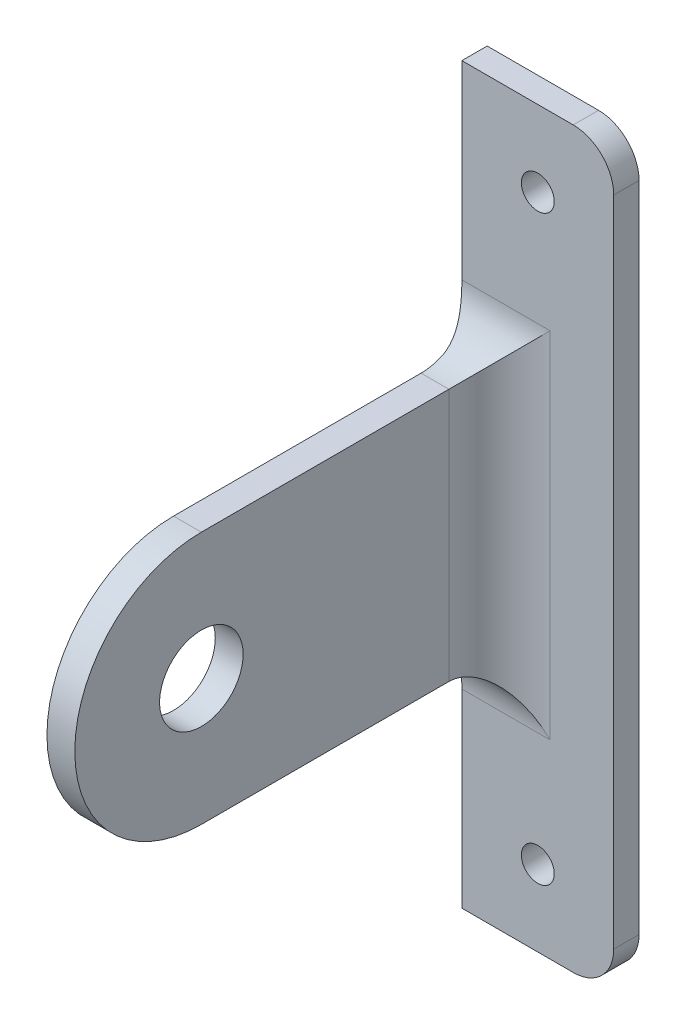
ISO-10303-21;
HEADER;
FILE_DESCRIPTION(('STEP AP214'),'2;1');
FILE_NAME('part.step','',(''),(''),'','','');
FILE_SCHEMA(('AUTOMOTIVE_DESIGN { 1 0 10303 214 1 1 1 1 }'));
ENDSEC;
DATA;
#1=APPLICATION_CONTEXT('core data for automotive mechanical design processes');
#2=APPLICATION_PROTOCOL_DEFINITION('international standard','automotive_design',2000,#1);
#3=PRODUCT_CONTEXT('',#1,'mechanical');
#4=PRODUCT('Part','Part','',(#3));
#5=PRODUCT_RELATED_PRODUCT_CATEGORY('part','',(#4));
#6=PRODUCT_DEFINITION_FORMATION('','',#4);
#7=PRODUCT_DEFINITION_CONTEXT('part definition',#1,'design');
#8=PRODUCT_DEFINITION('design','',#6,#7);
#9=PRODUCT_DEFINITION_SHAPE('','',#8);
#10=(LENGTH_UNIT() NAMED_UNIT(*) SI_UNIT(.MILLI.,.METRE.));
#11=(NAMED_UNIT(*) PLANE_ANGLE_UNIT() SI_UNIT($,.RADIAN.));
#12=(NAMED_UNIT(*) SI_UNIT($,.STERADIAN.) SOLID_ANGLE_UNIT());
#13=UNCERTAINTY_MEASURE_WITH_UNIT(LENGTH_MEASURE(1.E-05),#10,'distance_accuracy_value','');
#14=(GEOMETRIC_REPRESENTATION_CONTEXT(3) GLOBAL_UNCERTAINTY_ASSIGNED_CONTEXT((#13)) GLOBAL_UNIT_ASSIGNED_CONTEXT((#10,
#11,#12)) REPRESENTATION_CONTEXT('',''));
#15=CARTESIAN_POINT('',(0.,0.,0.));
#16=DIRECTION('',(0.,0.,1.));
#17=DIRECTION('',(1.,0.,0.));
#18=AXIS2_PLACEMENT_3D('',#15,#16,#17);
#19=CARTESIAN_POINT('',(0.,-12.5,0.));
#20=DIRECTION('',(0.,1.,0.));
#21=DIRECTION('',(0.,0.,1.));
#22=AXIS2_PLACEMENT_3D('',#19,#20,#21);
#23=PLANE('',#22);
#24=DIRECTION('',(0.,0.,1.));
#25=VECTOR('',#24,1.);
#26=CARTESIAN_POINT('',(0.,-12.5,-4.125));
#27=LINE('',#26,#25);
#28=CARTESIAN_POINT('',(0.,-12.5,-24.45));
#29=VERTEX_POINT('',#28);
#30=CARTESIAN_POINT('',(0.,-12.5,0.));
#31=VERTEX_POINT('',#30);
#32=EDGE_CURVE('E247',#29,#31,#27,.T.);
#33=ORIENTED_EDGE('',*,*,#32,.F.);
#34=DIRECTION('',(-1.,0.,0.));
#35=VECTOR('',#34,1.);
#36=CARTESIAN_POINT('',(2.75,-12.5,-24.45));
#37=LINE('',#36,#35);
#38=CARTESIAN_POINT('',(2.75,-12.5,-24.45));
#39=VERTEX_POINT('',#38);
#40=EDGE_CURVE('E265',#29,#39,#37,.F.);
#41=ORIENTED_EDGE('',*,*,#40,.T.);
#42=DIRECTION('',(0.,0.,-1.));
#43=VECTOR('',#42,1.);
#44=CARTESIAN_POINT('',(2.75,-12.5,-4.125));
#45=LINE('',#44,#43);
#46=CARTESIAN_POINT('',(2.75,-12.5,0.));
#47=VERTEX_POINT('',#46);
#48=EDGE_CURVE('E231',#47,#39,#45,.T.);
#49=ORIENTED_EDGE('',*,*,#48,.F.);
#50=DIRECTION('',(-1.,0.,0.));
#51=VECTOR('',#50,1.);
#52=CARTESIAN_POINT('',(2.75,-12.5,0.));
#53=LINE('',#52,#51);
#54=EDGE_CURVE('E218',#47,#31,#53,.T.);
#55=ORIENTED_EDGE('',*,*,#54,.T.);
#56=EDGE_LOOP('',(#33,#41,#49,#55));
#57=FACE_BOUND('',#56,.T.);
#58=ADVANCED_FACE('F43',(#57),#23,.F.);
#59=CARTESIAN_POINT('',(0.,12.5,0.));
#60=DIRECTION('',(0.,1.,0.));
#61=DIRECTION('',(0.,0.,1.));
#62=AXIS2_PLACEMENT_3D('',#59,#60,#61);
#63=PLANE('',#62);
#64=DIRECTION('',(0.,0.,-1.));
#65=VECTOR('',#64,1.);
#66=CARTESIAN_POINT('',(2.75,12.5,-4.125));
#67=LINE('',#66,#65);
#68=CARTESIAN_POINT('',(2.75,12.5,0.));
#69=VERTEX_POINT('',#68);
#70=CARTESIAN_POINT('',(2.75,12.5,-24.45));
#71=VERTEX_POINT('',#70);
#72=EDGE_CURVE('E242',#69,#71,#67,.T.);
#73=ORIENTED_EDGE('',*,*,#72,.T.);
#74=DIRECTION('',(-1.,0.,0.));
#75=VECTOR('',#74,1.);
#76=CARTESIAN_POINT('',(0.,12.5,-24.45));
#77=LINE('',#76,#75);
#78=CARTESIAN_POINT('',(0.,12.5,-24.45));
#79=VERTEX_POINT('',#78);
#80=EDGE_CURVE('E272',#71,#79,#77,.T.);
#81=ORIENTED_EDGE('',*,*,#80,.T.);
#82=DIRECTION('',(0.,0.,1.));
#83=VECTOR('',#82,1.);
#84=CARTESIAN_POINT('',(0.,12.5,-4.125));
#85=LINE('',#84,#83);
#86=CARTESIAN_POINT('',(0.,12.5,0.));
#87=VERTEX_POINT('',#86);
#88=EDGE_CURVE('E246',#79,#87,#85,.T.);
#89=ORIENTED_EDGE('',*,*,#88,.T.);
#90=DIRECTION('',(-1.,0.,0.));
#91=VECTOR('',#90,1.);
#92=CARTESIAN_POINT('',(2.75,12.5,0.));
#93=LINE('',#92,#91);
#94=EDGE_CURVE('E223',#69,#87,#93,.T.);
#95=ORIENTED_EDGE('',*,*,#94,.F.);
#96=EDGE_LOOP('',(#73,#81,#89,#95));
#97=FACE_BOUND('',#96,.T.);
#98=ADVANCED_FACE('F308',(#97),#63,.T.);
#99=CARTESIAN_POINT('',(2.75,12.5,-4.125));
#100=DIRECTION('',(-1.,0.,0.));
#101=DIRECTION('',(0.,0.,1.));
#102=AXIS2_PLACEMENT_3D('',#99,#100,#101);
#103=PLANE('',#102);
#104=CARTESIAN_POINT('',(2.75,0.,0.));
#105=DIRECTION('',(1.,0.,0.));
#106=DIRECTION('',(0.,0.,-1.));
#107=AXIS2_PLACEMENT_3D('',#104,#105,#106);
#108=CIRCLE('',#107,4.125);
#109=CARTESIAN_POINT('',(2.75,0.,-4.125));
#110=VERTEX_POINT('',#109);
#111=EDGE_CURVE('E222',#110,#110,#108,.T.);
#112=ORIENTED_EDGE('',*,*,#111,.F.);
#113=EDGE_LOOP('',(#112));
#114=FACE_BOUND('',#113,.T.);
#115=ORIENTED_EDGE('',*,*,#48,.T.);
#116=DIRECTION('',(0.,-1.,0.));
#117=VECTOR('',#116,1.);
#118=CARTESIAN_POINT('',(2.75,12.5,-24.45));
#119=LINE('',#118,#117);
#120=EDGE_CURVE('E275',#39,#71,#119,.F.);
#121=ORIENTED_EDGE('',*,*,#120,.T.);
#122=ORIENTED_EDGE('',*,*,#72,.F.);
#123=CARTESIAN_POINT('',(2.75,0.,0.));
#124=DIRECTION('',(1.,0.,0.));
#125=DIRECTION('',(0.,0.,-1.));
#126=AXIS2_PLACEMENT_3D('',#123,#124,#125);
#127=CIRCLE('',#126,12.5);
#128=EDGE_CURVE('E232',#69,#47,#127,.T.);
#129=ORIENTED_EDGE('',*,*,#128,.T.);
#130=EDGE_LOOP('',(#115,#121,#122,#129));
#131=FACE_BOUND('',#130,.T.);
#132=ADVANCED_FACE('F298',(#114,#131),#103,.F.);
#133=CARTESIAN_POINT('',(0.,12.5,-4.125));
#134=DIRECTION('',(1.,0.,0.));
#135=DIRECTION('',(0.,0.,-1.));
#136=AXIS2_PLACEMENT_3D('',#133,#134,#135);
#137=PLANE('',#136);
#138=CARTESIAN_POINT('',(0.,0.,0.));
#139=DIRECTION('',(1.,0.,0.));
#140=DIRECTION('',(0.,0.,-1.));
#141=AXIS2_PLACEMENT_3D('',#138,#139,#140);
#142=CIRCLE('',#141,4.125);
#143=CARTESIAN_POINT('',(0.,0.,-4.125));
#144=VERTEX_POINT('',#143);
#145=EDGE_CURVE('E227',#144,#144,#142,.T.);
#146=ORIENTED_EDGE('',*,*,#145,.T.);
#147=EDGE_LOOP('',(#146));
#148=FACE_BOUND('',#147,.T.);
#149=ORIENTED_EDGE('',*,*,#88,.F.);
#150=CARTESIAN_POINT('',(0.,17.5,-24.45));
#151=DIRECTION('',(1.,0.,0.));
#152=DIRECTION('',(0.,0.,-1.));
#153=AXIS2_PLACEMENT_3D('',#150,#151,#152);
#154=CIRCLE('',#153,5.);
#155=CARTESIAN_POINT('',(0.,12.9352791185284,-26.4904223274257));
#156=VERTEX_POINT('',#155);
#157=EDGE_CURVE('E11',#79,#156,#154,.T.);
#158=ORIENTED_EDGE('',*,*,#157,.T.);
#159=CARTESIAN_POINT('',(0.,12.9352791185284,-26.4904223274257));
#160=CARTESIAN_POINT('',(0.,12.5,-26.4904223274257));
#161=B_SPLINE_CURVE_WITH_KNOTS('',1,(#159,#160),.UNSPECIFIED.,.F.,.F.,(2,2),(0.,1.),.UNSPECIFIED.);
#162=CARTESIAN_POINT('',(0.,12.5,-26.4904223274257));
#163=VERTEX_POINT('',#162);
#164=EDGE_CURVE('E281',#156,#163,#161,.T.);
#165=ORIENTED_EDGE('',*,*,#164,.T.);
#166=DIRECTION('',(0.,-1.,0.));
#167=VECTOR('',#166,1.);
#168=CARTESIAN_POINT('',(0.,12.5,-26.4904223274257));
#169=LINE('',#168,#167);
#170=CARTESIAN_POINT('',(0.,-12.5,-26.4904223274257));
#171=VERTEX_POINT('',#170);
#172=EDGE_CURVE('E269',#163,#171,#169,.T.);
#173=ORIENTED_EDGE('',*,*,#172,.T.);
#174=CARTESIAN_POINT('',(0.,-12.5,-26.4904223274257));
#175=CARTESIAN_POINT('',(0.,-12.9352791185284,-26.4904223274257));
#176=B_SPLINE_CURVE_WITH_KNOTS('',1,(#174,#175),.UNSPECIFIED.,.F.,.F.,(2,2),(0.,1.),.UNSPECIFIED.);
#177=CARTESIAN_POINT('',(0.,-12.9352791185284,-26.4904223274257));
#178=VERTEX_POINT('',#177);
#179=EDGE_CURVE('E53',#171,#178,#176,.T.);
#180=ORIENTED_EDGE('',*,*,#179,.T.);
#181=CARTESIAN_POINT('',(0.,-17.5,-24.45));
#182=DIRECTION('',(1.,0.,0.));
#183=DIRECTION('',(0.,0.,-1.));
#184=AXIS2_PLACEMENT_3D('',#181,#182,#183);
#185=CIRCLE('',#184,5.);
#186=EDGE_CURVE('E278',#178,#29,#185,.T.);
#187=ORIENTED_EDGE('',*,*,#186,.T.);
#188=ORIENTED_EDGE('',*,*,#32,.T.);
#189=CARTESIAN_POINT('',(0.,0.,0.));
#190=DIRECTION('',(1.,0.,0.));
#191=DIRECTION('',(0.,0.,-1.));
#192=AXIS2_PLACEMENT_3D('',#189,#190,#191);
#193=CIRCLE('',#192,12.5);
#194=EDGE_CURVE('E217',#87,#31,#193,.T.);
#195=ORIENTED_EDGE('',*,*,#194,.F.);
#196=EDGE_LOOP('',(#149,#158,#165,#173,#180,#187,#188,#195));
#197=FACE_BOUND('',#196,.T.);
#198=ADVANCED_FACE('F287',(#148,#197),#137,.F.);
#199=CARTESIAN_POINT('',(2.75,12.5,-31.95));
#200=DIRECTION('',(0.,0.,1.));
#201=DIRECTION('',(1.,0.,0.));
#202=AXIS2_PLACEMENT_3D('',#199,#200,#201);
#203=PLANE('',#202);
#204=CARTESIAN_POINT('',(6.53,-28.75,-31.95));
#205=DIRECTION('',(0.,0.,1.));
#206=DIRECTION('',(-1.,0.,0.));
#207=AXIS2_PLACEMENT_3D('',#204,#205,#206);
#208=CIRCLE('',#207,1.625);
#209=CARTESIAN_POINT('',(4.905,-28.75,-31.95));
#210=VERTEX_POINT('',#209);
#211=EDGE_CURVE('E395',#210,#210,#208,.T.);
#212=ORIENTED_EDGE('',*,*,#211,.T.);
#213=EDGE_LOOP('',(#212));
#214=FACE_BOUND('',#213,.T.);
#215=CARTESIAN_POINT('',(6.53,28.75,-31.95));
#216=DIRECTION('',(0.,0.,-1.));
#217=DIRECTION('',(-1.,0.,0.));
#218=AXIS2_PLACEMENT_3D('',#215,#216,#217);
#219=CIRCLE('',#218,1.625);
#220=CARTESIAN_POINT('',(4.905,28.75,-31.95));
#221=VERTEX_POINT('',#220);
#222=EDGE_CURVE('E387',#221,#221,#219,.T.);
#223=ORIENTED_EDGE('',*,*,#222,.F.);
#224=EDGE_LOOP('',(#223));
#225=FACE_BOUND('',#224,.T.);
#226=DIRECTION('',(0.,-1.,0.));
#227=VECTOR('',#226,1.);
#228=CARTESIAN_POINT('',(14.03,12.5,-31.95));
#229=LINE('',#228,#227);
#230=CARTESIAN_POINT('',(14.03,32.25,-31.95));
#231=VERTEX_POINT('',#230);
#232=CARTESIAN_POINT('',(14.03,-32.25,-31.95));
#233=VERTEX_POINT('',#232);
#234=EDGE_CURVE('E214',#231,#233,#229,.T.);
#235=ORIENTED_EDGE('',*,*,#234,.T.);
#236=CARTESIAN_POINT('',(10.03,-32.25,-31.95));
#237=DIRECTION('',(0.,0.,1.));
#238=DIRECTION('',(-1.,0.,0.));
#239=AXIS2_PLACEMENT_3D('',#236,#237,#238);
#240=CIRCLE('',#239,4.);
#241=CARTESIAN_POINT('',(10.03,-36.25,-31.95));
#242=VERTEX_POINT('',#241);
#243=EDGE_CURVE('E171',#242,#233,#240,.T.);
#244=ORIENTED_EDGE('',*,*,#243,.F.);
#245=DIRECTION('',(1.,0.,0.));
#246=VECTOR('',#245,1.);
#247=CARTESIAN_POINT('',(-0.97,-36.25,-31.95));
#248=LINE('',#247,#246);
#249=CARTESIAN_POINT('',(-0.97,-36.25,-31.95));
#250=VERTEX_POINT('',#249);
#251=EDGE_CURVE('E166',#250,#242,#248,.T.);
#252=ORIENTED_EDGE('',*,*,#251,.F.);
#253=DIRECTION('',(0.,-1.,0.));
#254=VECTOR('',#253,1.);
#255=CARTESIAN_POINT('',(-0.97,12.5,-31.95));
#256=LINE('',#255,#254);
#257=CARTESIAN_POINT('',(-0.97,36.25,-31.95));
#258=VERTEX_POINT('',#257);
#259=EDGE_CURVE('E210',#258,#250,#256,.T.);
#260=ORIENTED_EDGE('',*,*,#259,.F.);
#261=DIRECTION('',(1.,0.,0.));
#262=VECTOR('',#261,1.);
#263=CARTESIAN_POINT('',(-0.97,36.25,-31.95));
#264=LINE('',#263,#262);
#265=CARTESIAN_POINT('',(10.03,36.25,-31.95));
#266=VERTEX_POINT('',#265);
#267=EDGE_CURVE('E191',#258,#266,#264,.T.);
#268=ORIENTED_EDGE('',*,*,#267,.T.);
#269=CARTESIAN_POINT('',(10.03,32.25,-31.95));
#270=DIRECTION('',(0.,0.,-1.));
#271=DIRECTION('',(-1.,0.,0.));
#272=AXIS2_PLACEMENT_3D('',#269,#270,#271);
#273=CIRCLE('',#272,4.);
#274=EDGE_CURVE('E187',#266,#231,#273,.T.);
#275=ORIENTED_EDGE('',*,*,#274,.T.);
#276=EDGE_LOOP('',(#235,#244,#252,#260,#268,#275));
#277=FACE_BOUND('',#276,.T.);
#278=ADVANCED_FACE('F297',(#214,#225,#277),#203,.F.);
#279=CARTESIAN_POINT('',(2.75,0.,0.));
#280=DIRECTION('',(-1.,0.,0.));
#281=DIRECTION('',(0.,0.,1.));
#282=AXIS2_PLACEMENT_3D('',#279,#280,#281);
#283=CYLINDRICAL_SURFACE('',#282,12.5);
#284=ORIENTED_EDGE('',*,*,#194,.T.);
#285=ORIENTED_EDGE('',*,*,#54,.F.);
#286=ORIENTED_EDGE('',*,*,#128,.F.);
#287=ORIENTED_EDGE('',*,*,#94,.T.);
#288=EDGE_LOOP('',(#284,#285,#286,#287));
#289=FACE_BOUND('',#288,.T.);
#290=ADVANCED_FACE('F304',(#289),#283,.T.);
#291=CARTESIAN_POINT('',(2.75,0.,0.));
#292=DIRECTION('',(-1.,0.,0.));
#293=DIRECTION('',(0.,0.,1.));
#294=AXIS2_PLACEMENT_3D('',#291,#292,#293);
#295=CYLINDRICAL_SURFACE('',#294,4.125);
#296=ORIENTED_EDGE('',*,*,#111,.T.);
#297=EDGE_LOOP('',(#296));
#298=FACE_BOUND('',#297,.T.);
#299=ORIENTED_EDGE('',*,*,#145,.F.);
#300=EDGE_LOOP('',(#299));
#301=FACE_BOUND('',#300,.T.);
#302=ADVANCED_FACE('F440',(#298,#301),#295,.F.);
#303=CARTESIAN_POINT('',(-0.97,12.5,-31.95));
#304=DIRECTION('',(1.,0.,0.));
#305=DIRECTION('',(0.,0.,-1.));
#306=AXIS2_PLACEMENT_3D('',#303,#304,#305);
#307=PLANE('',#306);
#308=ORIENTED_EDGE('',*,*,#259,.T.);
#309=DIRECTION('',(0.,0.,-1.));
#310=VECTOR('',#309,1.);
#311=CARTESIAN_POINT('',(-0.97,-36.25,-29.45));
#312=LINE('',#311,#310);
#313=CARTESIAN_POINT('',(-0.97,-36.25,-29.45));
#314=VERTEX_POINT('',#313);
#315=EDGE_CURVE('E177',#314,#250,#312,.T.);
#316=ORIENTED_EDGE('',*,*,#315,.F.);
#317=DIRECTION('',(0.,-1.,0.));
#318=VECTOR('',#317,1.);
#319=CARTESIAN_POINT('',(-0.97,12.5,-29.45));
#320=LINE('',#319,#318);
#321=CARTESIAN_POINT('',(-0.97,-17.5,-29.45));
#322=VERTEX_POINT('',#321);
#323=EDGE_CURVE('E155',#322,#314,#320,.T.);
#324=ORIENTED_EDGE('',*,*,#323,.F.);
#325=CARTESIAN_POINT('',(-0.97,17.5,-29.45));
#326=VERTEX_POINT('',#325);
#327=EDGE_CURVE('E211',#326,#322,#320,.T.);
#328=ORIENTED_EDGE('',*,*,#327,.F.);
#329=CARTESIAN_POINT('',(-0.97,36.25,-29.45));
#330=VERTEX_POINT('',#329);
#331=EDGE_CURVE('E206',#330,#326,#320,.T.);
#332=ORIENTED_EDGE('',*,*,#331,.F.);
#333=DIRECTION('',(0.,0.,-1.));
#334=VECTOR('',#333,1.);
#335=CARTESIAN_POINT('',(-0.97,36.25,-29.45));
#336=LINE('',#335,#334);
#337=EDGE_CURVE('E190',#330,#258,#336,.T.);
#338=ORIENTED_EDGE('',*,*,#337,.T.);
#339=EDGE_LOOP('',(#308,#316,#324,#328,#332,#338));
#340=FACE_BOUND('',#339,.T.);
#341=ADVANCED_FACE('F406',(#340),#307,.F.);
#342=CARTESIAN_POINT('',(14.03,12.5,-29.45));
#343=DIRECTION('',(0.,0.,-1.));
#344=DIRECTION('',(-1.,0.,0.));
#345=AXIS2_PLACEMENT_3D('',#342,#343,#344);
#346=PLANE('',#345);
#347=CARTESIAN_POINT('',(6.53,-28.75,-29.45));
#348=DIRECTION('',(0.,0.,1.));
#349=DIRECTION('',(-1.,0.,0.));
#350=AXIS2_PLACEMENT_3D('',#347,#348,#349);
#351=CIRCLE('',#350,1.625);
#352=CARTESIAN_POINT('',(4.905,-28.75,-29.45));
#353=VERTEX_POINT('',#352);
#354=EDGE_CURVE('E391',#353,#353,#351,.T.);
#355=ORIENTED_EDGE('',*,*,#354,.F.);
#356=EDGE_LOOP('',(#355));
#357=FACE_BOUND('',#356,.T.);
#358=CARTESIAN_POINT('',(6.53,28.75,-29.45));
#359=DIRECTION('',(0.,0.,-1.));
#360=DIRECTION('',(-1.,0.,0.));
#361=AXIS2_PLACEMENT_3D('',#358,#359,#360);
#362=CIRCLE('',#361,1.625);
#363=CARTESIAN_POINT('',(4.905,28.75,-29.45));
#364=VERTEX_POINT('',#363);
#365=EDGE_CURVE('E385',#364,#364,#362,.T.);
#366=ORIENTED_EDGE('',*,*,#365,.T.);
#367=EDGE_LOOP('',(#366));
#368=FACE_BOUND('',#367,.T.);
#369=DIRECTION('',(0.,-1.,0.));
#370=VECTOR('',#369,1.);
#371=CARTESIAN_POINT('',(7.75,-12.5,-29.45));
#372=LINE('',#371,#370);
#373=CARTESIAN_POINT('',(7.75,17.5,-29.45));
#374=VERTEX_POINT('',#373);
#375=CARTESIAN_POINT('',(7.75,-17.5,-29.45));
#376=VERTEX_POINT('',#375);
#377=EDGE_CURVE('E250',#374,#376,#372,.T.);
#378=ORIENTED_EDGE('',*,*,#377,.T.);
#379=DIRECTION('',(-1.,0.,0.));
#380=VECTOR('',#379,1.);
#381=CARTESIAN_POINT('',(0.,-17.5,-29.45));
#382=LINE('',#381,#380);
#383=EDGE_CURVE('E261',#376,#322,#382,.T.);
#384=ORIENTED_EDGE('',*,*,#383,.T.);
#385=ORIENTED_EDGE('',*,*,#323,.T.);
#386=DIRECTION('',(1.,0.,0.));
#387=VECTOR('',#386,1.);
#388=CARTESIAN_POINT('',(-0.97,-36.25,-29.45));
#389=LINE('',#388,#387);
#390=CARTESIAN_POINT('',(10.03,-36.25,-29.45));
#391=VERTEX_POINT('',#390);
#392=EDGE_CURVE('E161',#314,#391,#389,.T.);
#393=ORIENTED_EDGE('',*,*,#392,.T.);
#394=CARTESIAN_POINT('',(10.03,-32.25,-29.45));
#395=DIRECTION('',(0.,0.,1.));
#396=DIRECTION('',(-1.,0.,0.));
#397=AXIS2_PLACEMENT_3D('',#394,#395,#396);
#398=CIRCLE('',#397,4.);
#399=CARTESIAN_POINT('',(14.03,-32.25,-29.45));
#400=VERTEX_POINT('',#399);
#401=EDGE_CURVE('E158',#391,#400,#398,.T.);
#402=ORIENTED_EDGE('',*,*,#401,.T.);
#403=DIRECTION('',(0.,-1.,0.));
#404=VECTOR('',#403,1.);
#405=CARTESIAN_POINT('',(14.03,12.5,-29.45));
#406=LINE('',#405,#404);
#407=CARTESIAN_POINT('',(14.03,32.25,-29.45));
#408=VERTEX_POINT('',#407);
#409=EDGE_CURVE('E144',#408,#400,#406,.T.);
#410=ORIENTED_EDGE('',*,*,#409,.F.);
#411=CARTESIAN_POINT('',(10.03,32.25,-29.45));
#412=DIRECTION('',(0.,0.,-1.));
#413=DIRECTION('',(-1.,0.,0.));
#414=AXIS2_PLACEMENT_3D('',#411,#412,#413);
#415=CIRCLE('',#414,4.);
#416=CARTESIAN_POINT('',(10.03,36.25,-29.45));
#417=VERTEX_POINT('',#416);
#418=EDGE_CURVE('E186',#417,#408,#415,.T.);
#419=ORIENTED_EDGE('',*,*,#418,.F.);
#420=DIRECTION('',(1.,0.,0.));
#421=VECTOR('',#420,1.);
#422=CARTESIAN_POINT('',(-0.97,36.25,-29.45));
#423=LINE('',#422,#421);
#424=EDGE_CURVE('E182',#330,#417,#423,.T.);
#425=ORIENTED_EDGE('',*,*,#424,.F.);
#426=ORIENTED_EDGE('',*,*,#331,.T.);
#427=DIRECTION('',(-1.,0.,0.));
#428=VECTOR('',#427,1.);
#429=CARTESIAN_POINT('',(14.03,17.5,-29.45));
#430=LINE('',#429,#428);
#431=EDGE_CURVE('E258',#326,#374,#430,.F.);
#432=ORIENTED_EDGE('',*,*,#431,.T.);
#433=EDGE_LOOP('',(#378,#384,#385,#393,#402,#410,#419,#425,#426,#432));
#434=FACE_BOUND('',#433,.T.);
#435=ADVANCED_FACE('F159',(#357,#368,#434),#346,.F.);
#436=CARTESIAN_POINT('',(14.03,12.5,-31.95));
#437=DIRECTION('',(-1.,0.,0.));
#438=DIRECTION('',(0.,0.,1.));
#439=AXIS2_PLACEMENT_3D('',#436,#437,#438);
#440=PLANE('',#439);
#441=ORIENTED_EDGE('',*,*,#409,.T.);
#442=DIRECTION('',(0.,0.,-1.));
#443=VECTOR('',#442,1.);
#444=CARTESIAN_POINT('',(14.03,-32.25,-29.45));
#445=LINE('',#444,#443);
#446=EDGE_CURVE('E148',#400,#233,#445,.T.);
#447=ORIENTED_EDGE('',*,*,#446,.T.);
#448=ORIENTED_EDGE('',*,*,#234,.F.);
#449=DIRECTION('',(0.,0.,-1.));
#450=VECTOR('',#449,1.);
#451=CARTESIAN_POINT('',(14.03,32.25,-29.45));
#452=LINE('',#451,#450);
#453=EDGE_CURVE('E150',#408,#231,#452,.T.);
#454=ORIENTED_EDGE('',*,*,#453,.F.);
#455=EDGE_LOOP('',(#441,#447,#448,#454));
#456=FACE_BOUND('',#455,.T.);
#457=ADVANCED_FACE('F146',(#456),#440,.F.);
#458=CARTESIAN_POINT('',(10.03,32.25,-29.45));
#459=DIRECTION('',(0.,0.,-1.));
#460=DIRECTION('',(-1.,0.,0.));
#461=AXIS2_PLACEMENT_3D('',#458,#459,#460);
#462=CYLINDRICAL_SURFACE('',#461,4.);
#463=ORIENTED_EDGE('',*,*,#274,.F.);
#464=DIRECTION('',(0.,0.,-1.));
#465=VECTOR('',#464,1.);
#466=CARTESIAN_POINT('',(10.03,36.25,-29.45));
#467=LINE('',#466,#465);
#468=EDGE_CURVE('E200',#417,#266,#467,.T.);
#469=ORIENTED_EDGE('',*,*,#468,.F.);
#470=ORIENTED_EDGE('',*,*,#418,.T.);
#471=ORIENTED_EDGE('',*,*,#453,.T.);
#472=EDGE_LOOP('',(#463,#469,#470,#471));
#473=FACE_BOUND('',#472,.T.);
#474=ADVANCED_FACE('F418',(#473),#462,.T.);
#475=CARTESIAN_POINT('',(-0.97,36.25,-29.45));
#476=DIRECTION('',(0.,1.,0.));
#477=DIRECTION('',(0.,0.,1.));
#478=AXIS2_PLACEMENT_3D('',#475,#476,#477);
#479=PLANE('',#478);
#480=ORIENTED_EDGE('',*,*,#267,.F.);
#481=ORIENTED_EDGE('',*,*,#337,.F.);
#482=ORIENTED_EDGE('',*,*,#424,.T.);
#483=ORIENTED_EDGE('',*,*,#468,.T.);
#484=EDGE_LOOP('',(#480,#481,#482,#483));
#485=FACE_BOUND('',#484,.T.);
#486=ADVANCED_FACE('F423',(#485),#479,.T.);
#487=CARTESIAN_POINT('',(-0.97,-36.25,-29.45));
#488=DIRECTION('',(0.,1.,0.));
#489=DIRECTION('',(0.,0.,1.));
#490=AXIS2_PLACEMENT_3D('',#487,#488,#489);
#491=PLANE('',#490);
#492=ORIENTED_EDGE('',*,*,#251,.T.);
#493=DIRECTION('',(0.,0.,-1.));
#494=VECTOR('',#493,1.);
#495=CARTESIAN_POINT('',(10.03,-36.25,-29.45));
#496=LINE('',#495,#494);
#497=EDGE_CURVE('E173',#391,#242,#496,.T.);
#498=ORIENTED_EDGE('',*,*,#497,.F.);
#499=ORIENTED_EDGE('',*,*,#392,.F.);
#500=ORIENTED_EDGE('',*,*,#315,.T.);
#501=EDGE_LOOP('',(#492,#498,#499,#500));
#502=FACE_BOUND('',#501,.T.);
#503=ADVANCED_FACE('F426',(#502),#491,.F.);
#504=CARTESIAN_POINT('',(10.03,-32.25,-29.45));
#505=DIRECTION('',(0.,0.,-1.));
#506=DIRECTION('',(-1.,0.,0.));
#507=AXIS2_PLACEMENT_3D('',#504,#505,#506);
#508=CYLINDRICAL_SURFACE('',#507,4.);
#509=ORIENTED_EDGE('',*,*,#243,.T.);
#510=ORIENTED_EDGE('',*,*,#446,.F.);
#511=ORIENTED_EDGE('',*,*,#401,.F.);
#512=ORIENTED_EDGE('',*,*,#497,.T.);
#513=EDGE_LOOP('',(#509,#510,#511,#512));
#514=FACE_BOUND('',#513,.T.);
#515=ADVANCED_FACE('F169',(#514),#508,.T.);
#516=CARTESIAN_POINT('',(6.53,28.75,-29.45));
#517=DIRECTION('',(0.,0.,-1.));
#518=DIRECTION('',(-1.,0.,0.));
#519=AXIS2_PLACEMENT_3D('',#516,#517,#518);
#520=CYLINDRICAL_SURFACE('',#519,1.625);
#521=ORIENTED_EDGE('',*,*,#365,.F.);
#522=EDGE_LOOP('',(#521));
#523=FACE_BOUND('',#522,.T.);
#524=ORIENTED_EDGE('',*,*,#222,.T.);
#525=EDGE_LOOP('',(#524));
#526=FACE_BOUND('',#525,.T.);
#527=ADVANCED_FACE('F343',(#523,#526),#520,.F.);
#528=CARTESIAN_POINT('',(6.53,-28.75,-29.45));
#529=DIRECTION('',(0.,0.,-1.));
#530=DIRECTION('',(-1.,0.,0.));
#531=AXIS2_PLACEMENT_3D('',#528,#529,#530);
#532=CYLINDRICAL_SURFACE('',#531,1.625);
#533=ORIENTED_EDGE('',*,*,#354,.T.);
#534=EDGE_LOOP('',(#533));
#535=FACE_BOUND('',#534,.T.);
#536=ORIENTED_EDGE('',*,*,#211,.F.);
#537=EDGE_LOOP('',(#536));
#538=FACE_BOUND('',#537,.T.);
#539=ADVANCED_FACE('F336',(#535,#538),#532,.F.);
#540=CARTESIAN_POINT('',(0.,17.5,-24.45));
#541=DIRECTION('',(-1.,0.,0.));
#542=DIRECTION('',(0.,0.,1.));
#543=AXIS2_PLACEMENT_3D('',#540,#541,#542);
#544=CYLINDRICAL_SURFACE('',#543,5.);
#545=ORIENTED_EDGE('',*,*,#157,.F.);
#546=ORIENTED_EDGE('',*,*,#80,.F.);
#547=CARTESIAN_POINT('',(7.75,17.5,-24.45));
#548=DIRECTION('',(-0.707106781186547,0.707106781186547,0.));
#549=DIRECTION('',(0.707106781186547,0.707106781186547,0.));
#550=AXIS2_PLACEMENT_3D('',#547,#548,#549);
#551=ELLIPSE('',#550,7.07106781186547,5.);
#552=EDGE_CURVE('E47',#374,#71,#551,.T.);
#553=ORIENTED_EDGE('',*,*,#552,.F.);
#554=ORIENTED_EDGE('',*,*,#431,.F.);
#555=CARTESIAN_POINT('',(-0.97,17.5,-29.45));
#556=CARTESIAN_POINT('',(-0.970079899164056,17.3701049038207,-29.4500301365659));
#557=CARTESIAN_POINT('',(-0.966284576796977,17.2402500129345,-29.444939803141));
#558=CARTESIAN_POINT('',(-0.951551204793543,16.9818840424503,-29.4247605335802));
#559=CARTESIAN_POINT('',(-0.940622043722495,16.8533714925146,-29.409684039579));
#560=CARTESIAN_POINT('',(-0.912352046299374,16.5997565240031,-29.3699509679432));
#561=CARTESIAN_POINT('',(-0.895069028094303,16.4746339537154,-29.3453806810961));
#562=CARTESIAN_POINT('',(-0.855082497576353,16.2274269727635,-29.2870124477417));
#563=CARTESIAN_POINT('',(-0.832377482086573,16.105343415008,-29.2532119419049));
#564=CARTESIAN_POINT('',(-0.782816880609937,15.8654559815642,-29.1769477642139));
#565=CARTESIAN_POINT('',(-0.755981566245618,15.747634500377,-29.1345260958268));
#566=CARTESIAN_POINT('',(-0.699294757293463,15.516152033476,-29.0412870186986));
#567=CARTESIAN_POINT('',(-0.66944340943242,15.4024908457345,-28.9904700183051));
#568=CARTESIAN_POINT('',(-0.57696028922591,15.0675079823907,-28.8255122349336));
#569=CARTESIAN_POINT('',(-0.511559151953342,14.8528962193414,-28.6990922281402));
#570=CARTESIAN_POINT('',(-0.374301258983328,14.4173656935916,-28.3967087622663));
#571=CARTESIAN_POINT('',(-0.302726350453535,14.1993278789313,-28.2164166862097));
#572=CARTESIAN_POINT('',(-0.207238058290553,13.8961997256557,-27.9188054355513));
#573=CARTESIAN_POINT('',(-0.177418352421783,13.7992543282084,-27.8152232280683));
#574=CARTESIAN_POINT('',(-0.123261300433566,13.6139193241557,-27.5993808257014));
#575=CARTESIAN_POINT('',(-0.0989212666786567,13.5255255353961,-27.4871249214883));
#576=CARTESIAN_POINT('',(-0.0537066998880335,13.3435807966599,-27.234315876693));
#577=CARTESIAN_POINT('',(-0.0341646858240219,13.2517928573734,-27.092231038347));
#578=CARTESIAN_POINT('',(-0.0140201579687512,13.1248539090104,-26.8718450740968));
#579=CARTESIAN_POINT('',(-0.00883237271217802,13.0842682072443,-26.7970322882268));
#580=CARTESIAN_POINT('',(-0.00182011807073649,13.0068846804583,-26.6452626313622));
#581=CARTESIAN_POINT('',(2.25806700241875E-06,12.970089226354,-26.5683044561425));
#582=CARTESIAN_POINT('',(0.,12.9352791185284,-26.4904223274257));
#583=B_SPLINE_CURVE_WITH_KNOTS('',3,(#555,#556,#557,#558,#559,#560,#561,#562,#563,#564,#565,
#566,#567,#568,#569,#570,#571,#572,#573,#574,#575,#576,#577,#578,#579,#580,#581,#582),
.UNSPECIFIED.,.F.,.F.,(4,2,2,2,2,2,2,2,2,2,2,2,2,4),(0.,0.389466311164096,0.77844828202075,
1.16397487652975,1.54960847751762,1.93340642142806,2.31718570296248,3.08700618817996,
3.95804575551257,4.39245108998988,4.82664289359202,5.33611464761218,5.59177105585042,
5.84758642604938),.UNSPECIFIED.);
#584=EDGE_CURVE('E325',#156,#326,#583,.F.);
#585=ORIENTED_EDGE('',*,*,#584,.F.);
#586=EDGE_LOOP('',(#545,#546,#553,#554,#585));
#587=FACE_BOUND('',#586,.T.);
#588=ADVANCED_FACE('F333',(#587),#544,.F.);
#589=CARTESIAN_POINT('',(7.75,12.5,-24.45));
#590=DIRECTION('',(0.,1.,0.));
#591=DIRECTION('',(0.,0.,1.));
#592=AXIS2_PLACEMENT_3D('',#589,#590,#591);
#593=CYLINDRICAL_SURFACE('',#592,5.);
#594=ORIENTED_EDGE('',*,*,#552,.T.);
#595=ORIENTED_EDGE('',*,*,#120,.F.);
#596=CARTESIAN_POINT('',(7.75,-17.5,-24.45));
#597=DIRECTION('',(0.707106781186547,0.707106781186547,0.));
#598=DIRECTION('',(-0.707106781186547,0.707106781186547,0.));
#599=AXIS2_PLACEMENT_3D('',#596,#597,#598);
#600=ELLIPSE('',#599,7.07106781186547,5.);
#601=EDGE_CURVE('E332',#376,#39,#600,.T.);
#602=ORIENTED_EDGE('',*,*,#601,.F.);
#603=ORIENTED_EDGE('',*,*,#377,.F.);
#604=EDGE_LOOP('',(#594,#595,#602,#603));
#605=FACE_BOUND('',#604,.T.);
#606=ADVANCED_FACE('F45',(#605),#593,.F.);
#607=CARTESIAN_POINT('',(-5.,12.5,-26.4904223274257));
#608=DIRECTION('',(0.,-1.,0.));
#609=DIRECTION('',(0.,0.,-1.));
#610=AXIS2_PLACEMENT_3D('',#607,#608,#609);
#611=CYLINDRICAL_SURFACE('',#610,5.);
#612=ORIENTED_EDGE('',*,*,#584,.T.);
#613=ORIENTED_EDGE('',*,*,#327,.T.);
#614=CARTESIAN_POINT('',(-0.97,-17.5,-29.45));
#615=CARTESIAN_POINT('',(-0.970079899164056,-17.3701049038207,-29.4500301365659));
#616=CARTESIAN_POINT('',(-0.966284576796977,-17.2402500129345,-29.444939803141));
#617=CARTESIAN_POINT('',(-0.951551204793543,-16.9818840424503,-29.4247605335802));
#618=CARTESIAN_POINT('',(-0.940622043722495,-16.8533714925146,-29.409684039579));
#619=CARTESIAN_POINT('',(-0.912352046299374,-16.5997565240031,-29.3699509679432));
#620=CARTESIAN_POINT('',(-0.895069028094303,-16.4746339537154,-29.3453806810961));
#621=CARTESIAN_POINT('',(-0.855082497576353,-16.2274269727635,-29.2870124477417));
#622=CARTESIAN_POINT('',(-0.832377482086573,-16.105343415008,-29.2532119419049));
#623=CARTESIAN_POINT('',(-0.782816880609937,-15.8654559815642,-29.1769477642139));
#624=CARTESIAN_POINT('',(-0.755981566245618,-15.747634500377,-29.1345260958268));
#625=CARTESIAN_POINT('',(-0.699294757293463,-15.516152033476,-29.0412870186986));
#626=CARTESIAN_POINT('',(-0.66944340943242,-15.4024908457345,-28.9904700183051));
#627=CARTESIAN_POINT('',(-0.57696028922591,-15.0675079823907,-28.8255122349336));
#628=CARTESIAN_POINT('',(-0.511559151953341,-14.8528962193414,-28.6990922281402));
#629=CARTESIAN_POINT('',(-0.374301258983328,-14.4173656935916,-28.3967087622663));
#630=CARTESIAN_POINT('',(-0.302726350453535,-14.1993278789313,-28.2164166862097));
#631=CARTESIAN_POINT('',(-0.207238058290553,-13.8961997256557,-27.9188054355513));
#632=CARTESIAN_POINT('',(-0.177418352421783,-13.7992543282084,-27.8152232280683));
#633=CARTESIAN_POINT('',(-0.123261300433566,-13.6139193241557,-27.5993808257014));
#634=CARTESIAN_POINT('',(-0.0989212666786568,-13.5255255353961,-27.4871249214883));
#635=CARTESIAN_POINT('',(-0.0537066998880336,-13.3435807966599,-27.234315876693));
#636=CARTESIAN_POINT('',(-0.034164685824022,-13.2517928573734,-27.092231038347));
#637=CARTESIAN_POINT('',(-0.0140201579687513,-13.1248539090104,-26.8718450740968));
#638=CARTESIAN_POINT('',(-0.00883237271217809,-13.0842682072443,-26.7970322882268));
#639=CARTESIAN_POINT('',(-0.00182011807073658,-13.0068846804583,-26.6452626313622));
#640=CARTESIAN_POINT('',(2.25806700232282E-06,-12.970089226354,-26.5683044561425));
#641=CARTESIAN_POINT('',(0.,-12.9352791185284,-26.4904223274257));
#642=B_SPLINE_CURVE_WITH_KNOTS('',3,(#614,#615,#616,#617,#618,#619,#620,#621,#622,#623,#624,
#625,#626,#627,#628,#629,#630,#631,#632,#633,#634,#635,#636,#637,#638,#639,#640,#641),
.UNSPECIFIED.,.F.,.F.,(4,2,2,2,2,2,2,2,2,2,2,2,2,4),(0.,0.389466311164096,0.77844828202075,
1.16397487652975,1.54960847751762,1.93340642142806,2.31718570296248,3.08700618817996,
3.95804575551257,4.39245108998988,4.82664289359202,5.33611464761218,5.59177105585042,
5.84758642604938),.UNSPECIFIED.);
#643=EDGE_CURVE('E319',#178,#322,#642,.F.);
#644=ORIENTED_EDGE('',*,*,#643,.F.);
#645=ORIENTED_EDGE('',*,*,#179,.F.);
#646=ORIENTED_EDGE('',*,*,#172,.F.);
#647=ORIENTED_EDGE('',*,*,#164,.F.);
#648=EDGE_LOOP('',(#612,#613,#644,#645,#646,#647));
#649=FACE_BOUND('',#648,.T.);
#650=ADVANCED_FACE('F310',(#649),#611,.F.);
#651=CARTESIAN_POINT('',(14.03,-17.5,-24.45));
#652=DIRECTION('',(1.,0.,0.));
#653=DIRECTION('',(0.,0.,-1.));
#654=AXIS2_PLACEMENT_3D('',#651,#652,#653);
#655=CYLINDRICAL_SURFACE('',#654,5.);
#656=ORIENTED_EDGE('',*,*,#601,.T.);
#657=ORIENTED_EDGE('',*,*,#40,.F.);
#658=ORIENTED_EDGE('',*,*,#186,.F.);
#659=ORIENTED_EDGE('',*,*,#643,.T.);
#660=ORIENTED_EDGE('',*,*,#383,.F.);
#661=EDGE_LOOP('',(#656,#657,#658,#659,#660));
#662=FACE_BOUND('',#661,.T.);
#663=ADVANCED_FACE('F314',(#662),#655,.F.);
#664=CLOSED_SHELL('',(#58,#98,#132,#198,#278,#290,#302,#341,#435,#457,#474,#486,#503,#515,#527,
#539,#588,#606,#650,#663));
#665=MANIFOLD_SOLID_BREP('B2',#664);
#666=ADVANCED_BREP_SHAPE_REPRESENTATION('',(#18,#665),#14);
#667=SHAPE_DEFINITION_REPRESENTATION(#9,#666);
ENDSEC;
END-ISO-10303-21;
